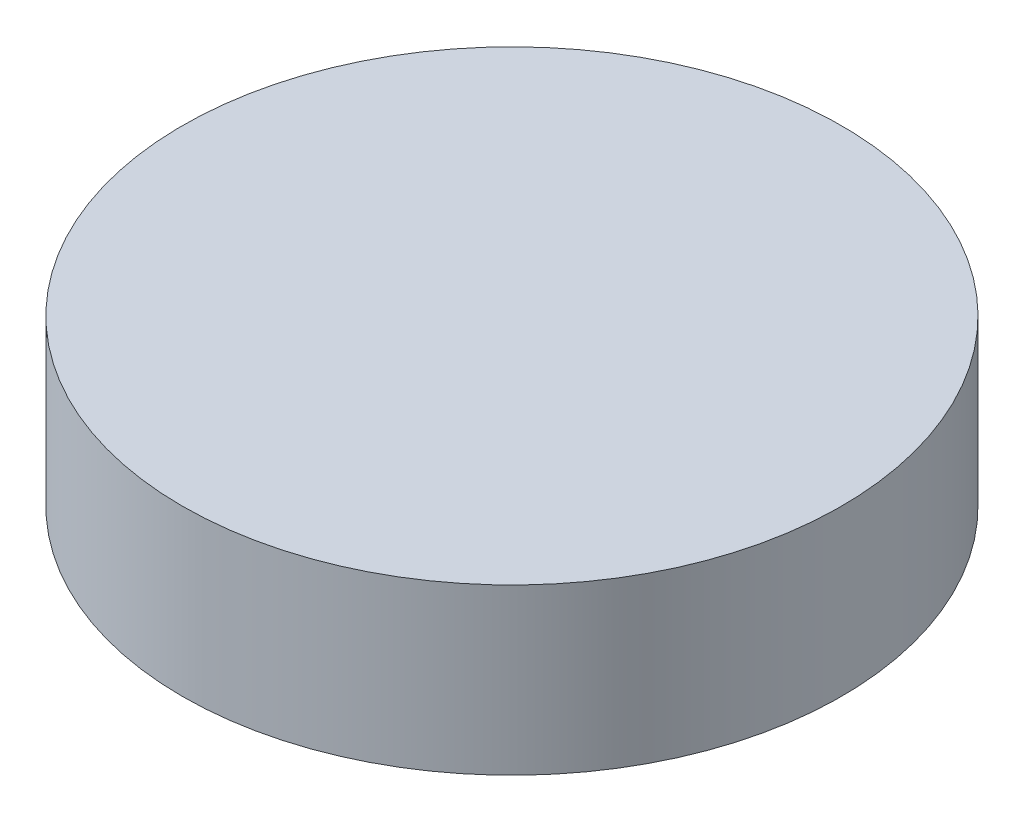
ISO-10303-21;
HEADER;
FILE_DESCRIPTION(('STEP AP214'),'2;1');
FILE_NAME('part.step','',(''),(''),'','','');
FILE_SCHEMA(('AUTOMOTIVE_DESIGN { 1 0 10303 214 1 1 1 1 }'));
ENDSEC;
DATA;
#1=APPLICATION_CONTEXT('core data for automotive mechanical design processes');
#2=APPLICATION_PROTOCOL_DEFINITION('international standard','automotive_design',2000,#1);
#3=PRODUCT_CONTEXT('',#1,'mechanical');
#4=PRODUCT('Part','Part','',(#3));
#5=PRODUCT_RELATED_PRODUCT_CATEGORY('part','',(#4));
#6=PRODUCT_DEFINITION_FORMATION('','',#4);
#7=PRODUCT_DEFINITION_CONTEXT('part definition',#1,'design');
#8=PRODUCT_DEFINITION('design','',#6,#7);
#9=PRODUCT_DEFINITION_SHAPE('','',#8);
#10=(LENGTH_UNIT() NAMED_UNIT(*) SI_UNIT(.MILLI.,.METRE.));
#11=(NAMED_UNIT(*) PLANE_ANGLE_UNIT() SI_UNIT($,.RADIAN.));
#12=(NAMED_UNIT(*) SI_UNIT($,.STERADIAN.) SOLID_ANGLE_UNIT());
#13=UNCERTAINTY_MEASURE_WITH_UNIT(LENGTH_MEASURE(1.E-05),#10,'distance_accuracy_value','');
#14=(GEOMETRIC_REPRESENTATION_CONTEXT(3) GLOBAL_UNCERTAINTY_ASSIGNED_CONTEXT((#13)) GLOBAL_UNIT_ASSIGNED_CONTEXT((#10,
#11,#12)) REPRESENTATION_CONTEXT('',''));
#15=CARTESIAN_POINT('',(0.,0.,0.));
#16=DIRECTION('',(0.,0.,1.));
#17=DIRECTION('',(1.,0.,0.));
#18=AXIS2_PLACEMENT_3D('',#15,#16,#17);
#19=CARTESIAN_POINT('',(0.,15.,0.));
#20=DIRECTION('',(0.,-1.,0.));
#21=DIRECTION('',(0.,0.,-1.));
#22=AXIS2_PLACEMENT_3D('',#19,#20,#21);
#23=CYLINDRICAL_SURFACE('',#22,30.);
#24=CARTESIAN_POINT('',(0.,15.,0.));
#25=DIRECTION('',(0.,1.,0.));
#26=DIRECTION('',(0.,0.,1.));
#27=AXIS2_PLACEMENT_3D('',#24,#25,#26);
#28=CIRCLE('',#27,30.);
#29=CARTESIAN_POINT('',(0.,15.,30.));
#30=VERTEX_POINT('',#29);
#31=EDGE_CURVE('E10',#30,#30,#28,.T.);
#32=ORIENTED_EDGE('',*,*,#31,.F.);
#33=EDGE_LOOP('',(#32));
#34=FACE_BOUND('',#33,.T.);
#35=CARTESIAN_POINT('',(0.,0.,0.));
#36=DIRECTION('',(0.,1.,0.));
#37=DIRECTION('',(0.,0.,1.));
#38=AXIS2_PLACEMENT_3D('',#35,#36,#37);
#39=CIRCLE('',#38,30.);
#40=CARTESIAN_POINT('',(0.,0.,30.));
#41=VERTEX_POINT('',#40);
#42=EDGE_CURVE('E44',#41,#41,#39,.T.);
#43=ORIENTED_EDGE('',*,*,#42,.T.);
#44=EDGE_LOOP('',(#43));
#45=FACE_BOUND('',#44,.T.);
#46=ADVANCED_FACE('F41',(#34,#45),#23,.T.);
#47=CARTESIAN_POINT('',(0.,15.,0.));
#48=DIRECTION('',(0.,1.,0.));
#49=DIRECTION('',(0.,0.,1.));
#50=AXIS2_PLACEMENT_3D('',#47,#48,#49);
#51=PLANE('',#50);
#52=ORIENTED_EDGE('',*,*,#31,.T.);
#53=EDGE_LOOP('',(#52));
#54=FACE_BOUND('',#53,.T.);
#55=ADVANCED_FACE('F58',(#54),#51,.T.);
#56=CARTESIAN_POINT('',(0.,0.,0.));
#57=DIRECTION('',(0.,1.,0.));
#58=DIRECTION('',(0.,0.,1.));
#59=AXIS2_PLACEMENT_3D('',#56,#57,#58);
#60=PLANE('',#59);
#61=ORIENTED_EDGE('',*,*,#42,.F.);
#62=EDGE_LOOP('',(#61));
#63=FACE_BOUND('',#62,.T.);
#64=ADVANCED_FACE('F56',(#63),#60,.F.);
#65=CLOSED_SHELL('',(#46,#55,#64));
#66=MANIFOLD_SOLID_BREP('B2',#65);
#67=ADVANCED_BREP_SHAPE_REPRESENTATION('',(#18,#66),#14);
#68=SHAPE_DEFINITION_REPRESENTATION(#9,#67);
ENDSEC;
END-ISO-10303-21;
